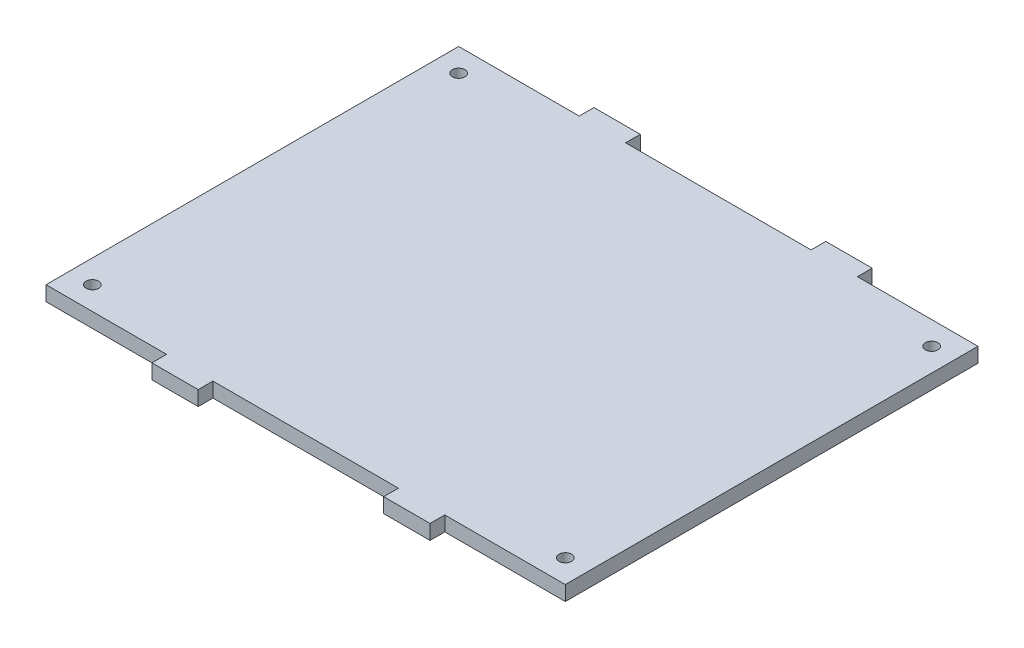
ISO-10303-21;
HEADER;
FILE_DESCRIPTION(('STEP AP214'),'2;1');
FILE_NAME('part.step','',(''),(''),'','','');
FILE_SCHEMA(('AUTOMOTIVE_DESIGN { 1 0 10303 214 1 1 1 1 }'));
ENDSEC;
DATA;
#1=APPLICATION_CONTEXT('core data for automotive mechanical design processes');
#2=APPLICATION_PROTOCOL_DEFINITION('international standard','automotive_design',2000,#1);
#3=PRODUCT_CONTEXT('',#1,'mechanical');
#4=PRODUCT('Part','Part','',(#3));
#5=PRODUCT_RELATED_PRODUCT_CATEGORY('part','',(#4));
#6=PRODUCT_DEFINITION_FORMATION('','',#4);
#7=PRODUCT_DEFINITION_CONTEXT('part definition',#1,'design');
#8=PRODUCT_DEFINITION('design','',#6,#7);
#9=PRODUCT_DEFINITION_SHAPE('','',#8);
#10=(LENGTH_UNIT() NAMED_UNIT(*) SI_UNIT(.MILLI.,.METRE.));
#11=(NAMED_UNIT(*) PLANE_ANGLE_UNIT() SI_UNIT($,.RADIAN.));
#12=(NAMED_UNIT(*) SI_UNIT($,.STERADIAN.) SOLID_ANGLE_UNIT());
#13=UNCERTAINTY_MEASURE_WITH_UNIT(LENGTH_MEASURE(1.E-05),#10,'distance_accuracy_value','');
#14=(GEOMETRIC_REPRESENTATION_CONTEXT(3) GLOBAL_UNCERTAINTY_ASSIGNED_CONTEXT((#13)) GLOBAL_UNIT_ASSIGNED_CONTEXT((#10,
#11,#12)) REPRESENTATION_CONTEXT('',''));
#15=CARTESIAN_POINT('',(0.,0.,0.));
#16=DIRECTION('',(0.,0.,1.));
#17=DIRECTION('',(1.,0.,0.));
#18=AXIS2_PLACEMENT_3D('',#15,#16,#17);
#19=CARTESIAN_POINT('',(-56.,3.175,47.675));
#20=DIRECTION('',(0.,0.,-1.));
#21=DIRECTION('',(-1.,0.,0.));
#22=AXIS2_PLACEMENT_3D('',#19,#20,#21);
#23=PLANE('',#22);
#24=DIRECTION('',(1.,0.,0.));
#25=VECTOR('',#24,1.);
#26=CARTESIAN_POINT('',(-56.,3.175,47.675));
#27=LINE('',#26,#25);
#28=CARTESIAN_POINT('',(-30.,3.175,47.675));
#29=VERTEX_POINT('',#28);
#30=CARTESIAN_POINT('',(-20.,3.175,47.675));
#31=VERTEX_POINT('',#30);
#32=EDGE_CURVE('E11',#29,#31,#27,.T.);
#33=ORIENTED_EDGE('',*,*,#32,.F.);
#34=DIRECTION('',(0.,1.,0.));
#35=VECTOR('',#34,1.);
#36=CARTESIAN_POINT('',(-30.,0.,47.675));
#37=LINE('',#36,#35);
#38=CARTESIAN_POINT('',(-30.,0.,47.675));
#39=VERTEX_POINT('',#38);
#40=EDGE_CURVE('E295',#39,#29,#37,.T.);
#41=ORIENTED_EDGE('',*,*,#40,.F.);
#42=DIRECTION('',(1.,0.,0.));
#43=VECTOR('',#42,1.);
#44=CARTESIAN_POINT('',(-56.,0.,47.675));
#45=LINE('',#44,#43);
#46=CARTESIAN_POINT('',(-20.,0.,47.675));
#47=VERTEX_POINT('',#46);
#48=EDGE_CURVE('E37',#39,#47,#45,.T.);
#49=ORIENTED_EDGE('',*,*,#48,.T.);
#50=DIRECTION('',(0.,1.,0.));
#51=VECTOR('',#50,1.);
#52=CARTESIAN_POINT('',(-20.,0.,47.675));
#53=LINE('',#52,#51);
#54=EDGE_CURVE('E277',#47,#31,#53,.T.);
#55=ORIENTED_EDGE('',*,*,#54,.T.);
#56=EDGE_LOOP('',(#33,#41,#49,#55));
#57=FACE_BOUND('',#56,.T.);
#58=ADVANCED_FACE('F33',(#57),#23,.F.);
#59=CARTESIAN_POINT('',(-56.,3.175,-47.675));
#60=DIRECTION('',(0.,0.,1.));
#61=DIRECTION('',(1.,0.,0.));
#62=AXIS2_PLACEMENT_3D('',#59,#60,#61);
#63=PLANE('',#62);
#64=DIRECTION('',(-1.,0.,0.));
#65=VECTOR('',#64,1.);
#66=CARTESIAN_POINT('',(-56.,0.,-47.675));
#67=LINE('',#66,#65);
#68=CARTESIAN_POINT('',(-20.,0.,-47.675));
#69=VERTEX_POINT('',#68);
#70=CARTESIAN_POINT('',(-30.,0.,-47.675));
#71=VERTEX_POINT('',#70);
#72=EDGE_CURVE('E200',#69,#71,#67,.T.);
#73=ORIENTED_EDGE('',*,*,#72,.T.);
#74=DIRECTION('',(0.,1.,0.));
#75=VECTOR('',#74,1.);
#76=CARTESIAN_POINT('',(-30.,0.,-47.675));
#77=LINE('',#76,#75);
#78=CARTESIAN_POINT('',(-30.,3.175,-47.675));
#79=VERTEX_POINT('',#78);
#80=EDGE_CURVE('E254',#71,#79,#77,.T.);
#81=ORIENTED_EDGE('',*,*,#80,.T.);
#82=DIRECTION('',(-1.,0.,0.));
#83=VECTOR('',#82,1.);
#84=CARTESIAN_POINT('',(-56.,3.175,-47.675));
#85=LINE('',#84,#83);
#86=CARTESIAN_POINT('',(-20.,3.175,-47.675));
#87=VERTEX_POINT('',#86);
#88=EDGE_CURVE('E211',#87,#79,#85,.T.);
#89=ORIENTED_EDGE('',*,*,#88,.F.);
#90=DIRECTION('',(0.,1.,0.));
#91=VECTOR('',#90,1.);
#92=CARTESIAN_POINT('',(-20.,0.,-47.675));
#93=LINE('',#92,#91);
#94=EDGE_CURVE('E204',#69,#87,#93,.T.);
#95=ORIENTED_EDGE('',*,*,#94,.F.);
#96=EDGE_LOOP('',(#73,#81,#89,#95));
#97=FACE_BOUND('',#96,.T.);
#98=ADVANCED_FACE('F399',(#97),#63,.F.);
#99=CARTESIAN_POINT('',(56.,3.175,47.675));
#100=DIRECTION('',(-1.,0.,0.));
#101=DIRECTION('',(0.,0.,1.));
#102=AXIS2_PLACEMENT_3D('',#99,#100,#101);
#103=PLANE('',#102);
#104=DIRECTION('',(0.,0.,-1.));
#105=VECTOR('',#104,1.);
#106=CARTESIAN_POINT('',(56.,3.175,47.675));
#107=LINE('',#106,#105);
#108=CARTESIAN_POINT('',(56.,3.175,44.5));
#109=VERTEX_POINT('',#108);
#110=CARTESIAN_POINT('',(56.,3.175,-44.5));
#111=VERTEX_POINT('',#110);
#112=EDGE_CURVE('E194',#109,#111,#107,.T.);
#113=ORIENTED_EDGE('',*,*,#112,.F.);
#114=DIRECTION('',(0.,1.,0.));
#115=VECTOR('',#114,1.);
#116=CARTESIAN_POINT('',(56.,0.,44.5));
#117=LINE('',#116,#115);
#118=CARTESIAN_POINT('',(56.,0.,44.5));
#119=VERTEX_POINT('',#118);
#120=EDGE_CURVE('E178',#119,#109,#117,.T.);
#121=ORIENTED_EDGE('',*,*,#120,.F.);
#122=DIRECTION('',(0.,0.,-1.));
#123=VECTOR('',#122,1.);
#124=CARTESIAN_POINT('',(56.,0.,47.675));
#125=LINE('',#124,#123);
#126=CARTESIAN_POINT('',(56.,0.,-44.5));
#127=VERTEX_POINT('',#126);
#128=EDGE_CURVE('E203',#119,#127,#125,.T.);
#129=ORIENTED_EDGE('',*,*,#128,.T.);
#130=DIRECTION('',(0.,1.,0.));
#131=VECTOR('',#130,1.);
#132=CARTESIAN_POINT('',(56.,0.,-44.5));
#133=LINE('',#132,#131);
#134=EDGE_CURVE('E242',#127,#111,#133,.T.);
#135=ORIENTED_EDGE('',*,*,#134,.T.);
#136=EDGE_LOOP('',(#113,#121,#129,#135));
#137=FACE_BOUND('',#136,.T.);
#138=ADVANCED_FACE('F35',(#137),#103,.F.);
#139=CARTESIAN_POINT('',(30.,3.175,-47.675));
#140=VERTEX_POINT('',#139);
#141=CARTESIAN_POINT('',(20.,3.175,-47.675));
#142=VERTEX_POINT('',#141);
#143=EDGE_CURVE('E209',#140,#142,#85,.T.);
#144=ORIENTED_EDGE('',*,*,#143,.F.);
#145=DIRECTION('',(0.,1.,0.));
#146=VECTOR('',#145,1.);
#147=CARTESIAN_POINT('',(30.,0.,-47.675));
#148=LINE('',#147,#146);
#149=CARTESIAN_POINT('',(30.,0.,-47.675));
#150=VERTEX_POINT('',#149);
#151=EDGE_CURVE('E232',#150,#140,#148,.T.);
#152=ORIENTED_EDGE('',*,*,#151,.F.);
#153=CARTESIAN_POINT('',(20.,0.,-47.675));
#154=VERTEX_POINT('',#153);
#155=EDGE_CURVE('E196',#150,#154,#67,.T.);
#156=ORIENTED_EDGE('',*,*,#155,.T.);
#157=DIRECTION('',(0.,1.,0.));
#158=VECTOR('',#157,1.);
#159=CARTESIAN_POINT('',(20.,0.,-47.675));
#160=LINE('',#159,#158);
#161=EDGE_CURVE('E218',#154,#142,#160,.T.);
#162=ORIENTED_EDGE('',*,*,#161,.T.);
#163=EDGE_LOOP('',(#144,#152,#156,#162));
#164=FACE_BOUND('',#163,.T.);
#165=ADVANCED_FACE('F405',(#164),#63,.F.);
#166=CARTESIAN_POINT('',(-56.,3.175,47.675));
#167=DIRECTION('',(1.,0.,0.));
#168=DIRECTION('',(0.,0.,-1.));
#169=AXIS2_PLACEMENT_3D('',#166,#167,#168);
#170=PLANE('',#169);
#171=DIRECTION('',(0.,0.,1.));
#172=VECTOR('',#171,1.);
#173=CARTESIAN_POINT('',(-56.,0.,47.675));
#174=LINE('',#173,#172);
#175=CARTESIAN_POINT('',(-56.,0.,-44.5));
#176=VERTEX_POINT('',#175);
#177=CARTESIAN_POINT('',(-56.,0.,44.5));
#178=VERTEX_POINT('',#177);
#179=EDGE_CURVE('E193',#176,#178,#174,.T.);
#180=ORIENTED_EDGE('',*,*,#179,.T.);
#181=DIRECTION('',(0.,1.,0.));
#182=VECTOR('',#181,1.);
#183=CARTESIAN_POINT('',(-56.,0.,44.5));
#184=LINE('',#183,#182);
#185=CARTESIAN_POINT('',(-56.,3.175,44.5));
#186=VERTEX_POINT('',#185);
#187=EDGE_CURVE('E58',#178,#186,#184,.T.);
#188=ORIENTED_EDGE('',*,*,#187,.T.);
#189=DIRECTION('',(0.,0.,1.));
#190=VECTOR('',#189,1.);
#191=CARTESIAN_POINT('',(-56.,3.175,47.675));
#192=LINE('',#191,#190);
#193=CARTESIAN_POINT('',(-56.,3.175,-44.5));
#194=VERTEX_POINT('',#193);
#195=EDGE_CURVE('E206',#194,#186,#192,.T.);
#196=ORIENTED_EDGE('',*,*,#195,.F.);
#197=DIRECTION('',(0.,1.,0.));
#198=VECTOR('',#197,1.);
#199=CARTESIAN_POINT('',(-56.,0.,-44.5));
#200=LINE('',#199,#198);
#201=EDGE_CURVE('E259',#176,#194,#200,.T.);
#202=ORIENTED_EDGE('',*,*,#201,.F.);
#203=EDGE_LOOP('',(#180,#188,#196,#202));
#204=FACE_BOUND('',#203,.T.);
#205=ADVANCED_FACE('F409',(#204),#170,.F.);
#206=CARTESIAN_POINT('',(20.,0.,47.675));
#207=VERTEX_POINT('',#206);
#208=CARTESIAN_POINT('',(30.,0.,47.675));
#209=VERTEX_POINT('',#208);
#210=EDGE_CURVE('E186',#207,#209,#45,.T.);
#211=ORIENTED_EDGE('',*,*,#210,.T.);
#212=DIRECTION('',(0.,1.,0.));
#213=VECTOR('',#212,1.);
#214=CARTESIAN_POINT('',(30.,0.,47.675));
#215=LINE('',#214,#213);
#216=CARTESIAN_POINT('',(30.,3.175,47.675));
#217=VERTEX_POINT('',#216);
#218=EDGE_CURVE('E170',#209,#217,#215,.T.);
#219=ORIENTED_EDGE('',*,*,#218,.T.);
#220=CARTESIAN_POINT('',(20.,3.175,47.675));
#221=VERTEX_POINT('',#220);
#222=EDGE_CURVE('E42',#221,#217,#27,.T.);
#223=ORIENTED_EDGE('',*,*,#222,.F.);
#224=DIRECTION('',(0.,1.,0.));
#225=VECTOR('',#224,1.);
#226=CARTESIAN_POINT('',(20.,0.,47.675));
#227=LINE('',#226,#225);
#228=EDGE_CURVE('E192',#207,#221,#227,.T.);
#229=ORIENTED_EDGE('',*,*,#228,.F.);
#230=EDGE_LOOP('',(#211,#219,#223,#229));
#231=FACE_BOUND('',#230,.T.);
#232=ADVANCED_FACE('F191',(#231),#23,.F.);
#233=CARTESIAN_POINT('',(0.,3.175,0.));
#234=DIRECTION('',(0.,-1.,0.));
#235=DIRECTION('',(0.,0.,-1.));
#236=AXIS2_PLACEMENT_3D('',#233,#234,#235);
#237=PLANE('',#236);
#238=CARTESIAN_POINT('',(51.,3.175,39.5));
#239=DIRECTION('',(0.,1.,0.));
#240=DIRECTION('',(0.,0.,1.));
#241=AXIS2_PLACEMENT_3D('',#238,#239,#240);
#242=CIRCLE('',#241,1.35);
#243=CARTESIAN_POINT('',(51.,3.175,40.85));
#244=VERTEX_POINT('',#243);
#245=EDGE_CURVE('E342',#244,#244,#242,.T.);
#246=ORIENTED_EDGE('',*,*,#245,.F.);
#247=EDGE_LOOP('',(#246));
#248=FACE_BOUND('',#247,.T.);
#249=CARTESIAN_POINT('',(-51.,3.175,39.5));
#250=DIRECTION('',(0.,1.,0.));
#251=DIRECTION('',(0.,0.,1.));
#252=AXIS2_PLACEMENT_3D('',#249,#250,#251);
#253=CIRCLE('',#252,1.35);
#254=CARTESIAN_POINT('',(-51.,3.175,40.85));
#255=VERTEX_POINT('',#254);
#256=EDGE_CURVE('E336',#255,#255,#253,.T.);
#257=ORIENTED_EDGE('',*,*,#256,.F.);
#258=EDGE_LOOP('',(#257));
#259=FACE_BOUND('',#258,.T.);
#260=CARTESIAN_POINT('',(51.,3.175,-39.5));
#261=DIRECTION('',(0.,1.,0.));
#262=DIRECTION('',(0.,0.,1.));
#263=AXIS2_PLACEMENT_3D('',#260,#261,#262);
#264=CIRCLE('',#263,1.35);
#265=CARTESIAN_POINT('',(51.,3.175,-38.15));
#266=VERTEX_POINT('',#265);
#267=EDGE_CURVE('E330',#266,#266,#264,.T.);
#268=ORIENTED_EDGE('',*,*,#267,.F.);
#269=EDGE_LOOP('',(#268));
#270=FACE_BOUND('',#269,.T.);
#271=CARTESIAN_POINT('',(-51.,3.175,-39.5));
#272=DIRECTION('',(0.,1.,0.));
#273=DIRECTION('',(0.,0.,1.));
#274=AXIS2_PLACEMENT_3D('',#271,#272,#273);
#275=CIRCLE('',#274,1.35);
#276=CARTESIAN_POINT('',(-51.,3.175,-38.15));
#277=VERTEX_POINT('',#276);
#278=EDGE_CURVE('E324',#277,#277,#275,.T.);
#279=ORIENTED_EDGE('',*,*,#278,.F.);
#280=EDGE_LOOP('',(#279));
#281=FACE_BOUND('',#280,.T.);
#282=ORIENTED_EDGE('',*,*,#222,.T.);
#283=DIRECTION('',(0.,0.,1.));
#284=VECTOR('',#283,1.);
#285=CARTESIAN_POINT('',(30.,3.175,44.5));
#286=LINE('',#285,#284);
#287=CARTESIAN_POINT('',(30.,3.175,44.5));
#288=VERTEX_POINT('',#287);
#289=EDGE_CURVE('E173',#288,#217,#286,.T.);
#290=ORIENTED_EDGE('',*,*,#289,.F.);
#291=DIRECTION('',(-1.,0.,0.));
#292=VECTOR('',#291,1.);
#293=CARTESIAN_POINT('',(30.,3.175,44.5));
#294=LINE('',#293,#292);
#295=EDGE_CURVE('E188',#109,#288,#294,.T.);
#296=ORIENTED_EDGE('',*,*,#295,.F.);
#297=ORIENTED_EDGE('',*,*,#112,.T.);
#298=DIRECTION('',(1.,0.,0.));
#299=VECTOR('',#298,1.);
#300=CARTESIAN_POINT('',(30.,3.175,-44.5));
#301=LINE('',#300,#299);
#302=CARTESIAN_POINT('',(30.,3.175,-44.5));
#303=VERTEX_POINT('',#302);
#304=EDGE_CURVE('E247',#303,#111,#301,.T.);
#305=ORIENTED_EDGE('',*,*,#304,.F.);
#306=DIRECTION('',(0.,0.,1.));
#307=VECTOR('',#306,1.);
#308=CARTESIAN_POINT('',(30.,3.175,-47.675));
#309=LINE('',#308,#307);
#310=EDGE_CURVE('E251',#140,#303,#309,.T.);
#311=ORIENTED_EDGE('',*,*,#310,.F.);
#312=ORIENTED_EDGE('',*,*,#143,.T.);
#313=DIRECTION('',(0.,0.,-1.));
#314=VECTOR('',#313,1.);
#315=CARTESIAN_POINT('',(20.,3.175,-47.675));
#316=LINE('',#315,#314);
#317=CARTESIAN_POINT('',(20.,3.175,-44.5));
#318=VERTEX_POINT('',#317);
#319=EDGE_CURVE('E222',#318,#142,#316,.T.);
#320=ORIENTED_EDGE('',*,*,#319,.F.);
#321=DIRECTION('',(1.,0.,0.));
#322=VECTOR('',#321,1.);
#323=CARTESIAN_POINT('',(-20.,3.175,-44.5));
#324=LINE('',#323,#322);
#325=CARTESIAN_POINT('',(-20.,3.175,-44.5));
#326=VERTEX_POINT('',#325);
#327=EDGE_CURVE('E226',#326,#318,#324,.T.);
#328=ORIENTED_EDGE('',*,*,#327,.F.);
#329=DIRECTION('',(0.,0.,1.));
#330=VECTOR('',#329,1.);
#331=CARTESIAN_POINT('',(-20.,3.175,-47.675));
#332=LINE('',#331,#330);
#333=EDGE_CURVE('E229',#87,#326,#332,.T.);
#334=ORIENTED_EDGE('',*,*,#333,.F.);
#335=ORIENTED_EDGE('',*,*,#88,.T.);
#336=DIRECTION('',(0.,0.,-1.));
#337=VECTOR('',#336,1.);
#338=CARTESIAN_POINT('',(-30.,3.175,-47.675));
#339=LINE('',#338,#337);
#340=CARTESIAN_POINT('',(-30.,3.175,-44.5));
#341=VERTEX_POINT('',#340);
#342=EDGE_CURVE('E266',#341,#79,#339,.T.);
#343=ORIENTED_EDGE('',*,*,#342,.F.);
#344=DIRECTION('',(1.,0.,0.));
#345=VECTOR('',#344,1.);
#346=CARTESIAN_POINT('',(-56.,3.175,-44.5));
#347=LINE('',#346,#345);
#348=EDGE_CURVE('E269',#194,#341,#347,.T.);
#349=ORIENTED_EDGE('',*,*,#348,.F.);
#350=ORIENTED_EDGE('',*,*,#195,.T.);
#351=DIRECTION('',(-1.,0.,0.));
#352=VECTOR('',#351,1.);
#353=CARTESIAN_POINT('',(-30.,3.175,44.5));
#354=LINE('',#353,#352);
#355=CARTESIAN_POINT('',(-30.,3.175,44.5));
#356=VERTEX_POINT('',#355);
#357=EDGE_CURVE('E307',#356,#186,#354,.T.);
#358=ORIENTED_EDGE('',*,*,#357,.F.);
#359=DIRECTION('',(0.,0.,-1.));
#360=VECTOR('',#359,1.);
#361=CARTESIAN_POINT('',(-30.,3.175,44.5));
#362=LINE('',#361,#360);
#363=EDGE_CURVE('E310',#29,#356,#362,.T.);
#364=ORIENTED_EDGE('',*,*,#363,.F.);
#365=ORIENTED_EDGE('',*,*,#32,.T.);
#366=DIRECTION('',(0.,0.,1.));
#367=VECTOR('',#366,1.);
#368=CARTESIAN_POINT('',(-20.,3.175,47.675));
#369=LINE('',#368,#367);
#370=CARTESIAN_POINT('',(-20.,3.175,44.5));
#371=VERTEX_POINT('',#370);
#372=EDGE_CURVE('E292',#371,#31,#369,.T.);
#373=ORIENTED_EDGE('',*,*,#372,.F.);
#374=DIRECTION('',(-1.,0.,0.));
#375=VECTOR('',#374,1.);
#376=CARTESIAN_POINT('',(-20.,3.175,44.5));
#377=LINE('',#376,#375);
#378=CARTESIAN_POINT('',(20.,3.175,44.5));
#379=VERTEX_POINT('',#378);
#380=EDGE_CURVE('E285',#379,#371,#377,.T.);
#381=ORIENTED_EDGE('',*,*,#380,.F.);
#382=DIRECTION('',(0.,0.,-1.));
#383=VECTOR('',#382,1.);
#384=CARTESIAN_POINT('',(20.,3.175,47.675));
#385=LINE('',#384,#383);
#386=EDGE_CURVE('E289',#221,#379,#385,.T.);
#387=ORIENTED_EDGE('',*,*,#386,.F.);
#388=EDGE_LOOP('',(#282,#290,#296,#297,#305,#311,#312,#320,#328,#334,#335,#343,#349,#350,#358,
#364,#365,#373,#381,#387));
#389=FACE_BOUND('',#388,.T.);
#390=ADVANCED_FACE('F357',(#248,#259,#270,#281,#389),#237,.F.);
#391=CARTESIAN_POINT('',(0.,0.,0.));
#392=DIRECTION('',(0.,-1.,0.));
#393=DIRECTION('',(0.,0.,-1.));
#394=AXIS2_PLACEMENT_3D('',#391,#392,#393);
#395=PLANE('',#394);
#396=CARTESIAN_POINT('',(51.,0.,39.5));
#397=DIRECTION('',(0.,1.,0.));
#398=DIRECTION('',(0.,0.,1.));
#399=AXIS2_PLACEMENT_3D('',#396,#397,#398);
#400=CIRCLE('',#399,1.35);
#401=CARTESIAN_POINT('',(51.,0.,40.85));
#402=VERTEX_POINT('',#401);
#403=EDGE_CURVE('E339',#402,#402,#400,.T.);
#404=ORIENTED_EDGE('',*,*,#403,.T.);
#405=EDGE_LOOP('',(#404));
#406=FACE_BOUND('',#405,.T.);
#407=CARTESIAN_POINT('',(-51.,0.,39.5));
#408=DIRECTION('',(0.,1.,0.));
#409=DIRECTION('',(0.,0.,1.));
#410=AXIS2_PLACEMENT_3D('',#407,#408,#409);
#411=CIRCLE('',#410,1.35);
#412=CARTESIAN_POINT('',(-51.,0.,40.85));
#413=VERTEX_POINT('',#412);
#414=EDGE_CURVE('E333',#413,#413,#411,.T.);
#415=ORIENTED_EDGE('',*,*,#414,.T.);
#416=EDGE_LOOP('',(#415));
#417=FACE_BOUND('',#416,.T.);
#418=CARTESIAN_POINT('',(51.,0.,-39.5));
#419=DIRECTION('',(0.,1.,0.));
#420=DIRECTION('',(0.,0.,1.));
#421=AXIS2_PLACEMENT_3D('',#418,#419,#420);
#422=CIRCLE('',#421,1.35);
#423=CARTESIAN_POINT('',(51.,0.,-38.15));
#424=VERTEX_POINT('',#423);
#425=EDGE_CURVE('E327',#424,#424,#422,.T.);
#426=ORIENTED_EDGE('',*,*,#425,.T.);
#427=EDGE_LOOP('',(#426));
#428=FACE_BOUND('',#427,.T.);
#429=CARTESIAN_POINT('',(-51.,0.,-39.5));
#430=DIRECTION('',(0.,1.,0.));
#431=DIRECTION('',(0.,0.,1.));
#432=AXIS2_PLACEMENT_3D('',#429,#430,#431);
#433=CIRCLE('',#432,1.35);
#434=CARTESIAN_POINT('',(-51.,0.,-38.15));
#435=VERTEX_POINT('',#434);
#436=EDGE_CURVE('E322',#435,#435,#433,.T.);
#437=ORIENTED_EDGE('',*,*,#436,.T.);
#438=EDGE_LOOP('',(#437));
#439=FACE_BOUND('',#438,.T.);
#440=DIRECTION('',(0.,0.,1.));
#441=VECTOR('',#440,1.);
#442=CARTESIAN_POINT('',(30.,0.,44.5));
#443=LINE('',#442,#441);
#444=CARTESIAN_POINT('',(30.,0.,44.5));
#445=VERTEX_POINT('',#444);
#446=EDGE_CURVE('E50',#445,#209,#443,.T.);
#447=ORIENTED_EDGE('',*,*,#446,.T.);
#448=ORIENTED_EDGE('',*,*,#210,.F.);
#449=DIRECTION('',(0.,0.,-1.));
#450=VECTOR('',#449,1.);
#451=CARTESIAN_POINT('',(20.,0.,47.675));
#452=LINE('',#451,#450);
#453=CARTESIAN_POINT('',(20.,0.,44.5));
#454=VERTEX_POINT('',#453);
#455=EDGE_CURVE('E298',#207,#454,#452,.T.);
#456=ORIENTED_EDGE('',*,*,#455,.T.);
#457=DIRECTION('',(-1.,0.,0.));
#458=VECTOR('',#457,1.);
#459=CARTESIAN_POINT('',(-20.,0.,44.5));
#460=LINE('',#459,#458);
#461=CARTESIAN_POINT('',(-20.,0.,44.5));
#462=VERTEX_POINT('',#461);
#463=EDGE_CURVE('E280',#454,#462,#460,.T.);
#464=ORIENTED_EDGE('',*,*,#463,.T.);
#465=DIRECTION('',(0.,0.,1.));
#466=VECTOR('',#465,1.);
#467=CARTESIAN_POINT('',(-20.,0.,47.675));
#468=LINE('',#467,#466);
#469=EDGE_CURVE('E288',#462,#47,#468,.T.);
#470=ORIENTED_EDGE('',*,*,#469,.T.);
#471=ORIENTED_EDGE('',*,*,#48,.F.);
#472=DIRECTION('',(0.,0.,-1.));
#473=VECTOR('',#472,1.);
#474=CARTESIAN_POINT('',(-30.,0.,44.5));
#475=LINE('',#474,#473);
#476=CARTESIAN_POINT('',(-30.,0.,44.5));
#477=VERTEX_POINT('',#476);
#478=EDGE_CURVE('E309',#39,#477,#475,.T.);
#479=ORIENTED_EDGE('',*,*,#478,.T.);
#480=DIRECTION('',(-1.,0.,0.));
#481=VECTOR('',#480,1.);
#482=CARTESIAN_POINT('',(-30.,0.,44.5));
#483=LINE('',#482,#481);
#484=EDGE_CURVE('E304',#477,#178,#483,.T.);
#485=ORIENTED_EDGE('',*,*,#484,.T.);
#486=ORIENTED_EDGE('',*,*,#179,.F.);
#487=DIRECTION('',(1.,0.,0.));
#488=VECTOR('',#487,1.);
#489=CARTESIAN_POINT('',(-56.,0.,-44.5));
#490=LINE('',#489,#488);
#491=CARTESIAN_POINT('',(-30.,0.,-44.5));
#492=VERTEX_POINT('',#491);
#493=EDGE_CURVE('E268',#176,#492,#490,.T.);
#494=ORIENTED_EDGE('',*,*,#493,.T.);
#495=DIRECTION('',(0.,0.,-1.));
#496=VECTOR('',#495,1.);
#497=CARTESIAN_POINT('',(-30.,0.,-47.675));
#498=LINE('',#497,#496);
#499=EDGE_CURVE('E262',#492,#71,#498,.T.);
#500=ORIENTED_EDGE('',*,*,#499,.T.);
#501=ORIENTED_EDGE('',*,*,#72,.F.);
#502=DIRECTION('',(0.,0.,1.));
#503=VECTOR('',#502,1.);
#504=CARTESIAN_POINT('',(-20.,0.,-47.675));
#505=LINE('',#504,#503);
#506=CARTESIAN_POINT('',(-20.,0.,-44.5));
#507=VERTEX_POINT('',#506);
#508=EDGE_CURVE('E225',#69,#507,#505,.T.);
#509=ORIENTED_EDGE('',*,*,#508,.T.);
#510=DIRECTION('',(1.,0.,0.));
#511=VECTOR('',#510,1.);
#512=CARTESIAN_POINT('',(-20.,0.,-44.5));
#513=LINE('',#512,#511);
#514=CARTESIAN_POINT('',(20.,0.,-44.5));
#515=VERTEX_POINT('',#514);
#516=EDGE_CURVE('E235',#507,#515,#513,.T.);
#517=ORIENTED_EDGE('',*,*,#516,.T.);
#518=DIRECTION('',(0.,0.,-1.));
#519=VECTOR('',#518,1.);
#520=CARTESIAN_POINT('',(20.,0.,-47.675));
#521=LINE('',#520,#519);
#522=EDGE_CURVE('E216',#515,#154,#521,.T.);
#523=ORIENTED_EDGE('',*,*,#522,.T.);
#524=ORIENTED_EDGE('',*,*,#155,.F.);
#525=DIRECTION('',(0.,0.,1.));
#526=VECTOR('',#525,1.);
#527=CARTESIAN_POINT('',(30.,0.,-47.675));
#528=LINE('',#527,#526);
#529=CARTESIAN_POINT('',(30.,0.,-44.5));
#530=VERTEX_POINT('',#529);
#531=EDGE_CURVE('E250',#150,#530,#528,.T.);
#532=ORIENTED_EDGE('',*,*,#531,.T.);
#533=DIRECTION('',(1.,0.,0.));
#534=VECTOR('',#533,1.);
#535=CARTESIAN_POINT('',(30.,0.,-44.5));
#536=LINE('',#535,#534);
#537=EDGE_CURVE('E243',#530,#127,#536,.T.);
#538=ORIENTED_EDGE('',*,*,#537,.T.);
#539=ORIENTED_EDGE('',*,*,#128,.F.);
#540=DIRECTION('',(-1.,0.,0.));
#541=VECTOR('',#540,1.);
#542=CARTESIAN_POINT('',(30.,0.,44.5));
#543=LINE('',#542,#541);
#544=EDGE_CURVE('E179',#119,#445,#543,.T.);
#545=ORIENTED_EDGE('',*,*,#544,.T.);
#546=EDGE_LOOP('',(#447,#448,#456,#464,#470,#471,#479,#485,#486,#494,#500,#501,#509,#517,#523,
#524,#532,#538,#539,#545));
#547=FACE_BOUND('',#546,.T.);
#548=ADVANCED_FACE('F184',(#406,#417,#428,#439,#547),#395,.T.);
#549=CARTESIAN_POINT('',(-20.,0.,-47.675));
#550=DIRECTION('',(-1.,0.,0.));
#551=DIRECTION('',(0.,0.,1.));
#552=AXIS2_PLACEMENT_3D('',#549,#550,#551);
#553=PLANE('',#552);
#554=ORIENTED_EDGE('',*,*,#333,.T.);
#555=DIRECTION('',(0.,1.,0.));
#556=VECTOR('',#555,1.);
#557=CARTESIAN_POINT('',(-20.,0.,-44.5));
#558=LINE('',#557,#556);
#559=EDGE_CURVE('E213',#507,#326,#558,.T.);
#560=ORIENTED_EDGE('',*,*,#559,.F.);
#561=ORIENTED_EDGE('',*,*,#508,.F.);
#562=ORIENTED_EDGE('',*,*,#94,.T.);
#563=EDGE_LOOP('',(#554,#560,#561,#562));
#564=FACE_BOUND('',#563,.T.);
#565=ADVANCED_FACE('F469',(#564),#553,.F.);
#566=CARTESIAN_POINT('',(20.,0.,-47.675));
#567=DIRECTION('',(1.,0.,0.));
#568=DIRECTION('',(0.,0.,-1.));
#569=AXIS2_PLACEMENT_3D('',#566,#567,#568);
#570=PLANE('',#569);
#571=ORIENTED_EDGE('',*,*,#319,.T.);
#572=ORIENTED_EDGE('',*,*,#161,.F.);
#573=ORIENTED_EDGE('',*,*,#522,.F.);
#574=DIRECTION('',(0.,1.,0.));
#575=VECTOR('',#574,1.);
#576=CARTESIAN_POINT('',(20.,0.,-44.5));
#577=LINE('',#576,#575);
#578=EDGE_CURVE('E215',#515,#318,#577,.T.);
#579=ORIENTED_EDGE('',*,*,#578,.T.);
#580=EDGE_LOOP('',(#571,#572,#573,#579));
#581=FACE_BOUND('',#580,.T.);
#582=ADVANCED_FACE('F430',(#581),#570,.F.);
#583=CARTESIAN_POINT('',(-20.,0.,-44.5));
#584=DIRECTION('',(0.,0.,1.));
#585=DIRECTION('',(1.,0.,0.));
#586=AXIS2_PLACEMENT_3D('',#583,#584,#585);
#587=PLANE('',#586);
#588=ORIENTED_EDGE('',*,*,#327,.T.);
#589=ORIENTED_EDGE('',*,*,#578,.F.);
#590=ORIENTED_EDGE('',*,*,#516,.F.);
#591=ORIENTED_EDGE('',*,*,#559,.T.);
#592=EDGE_LOOP('',(#588,#589,#590,#591));
#593=FACE_BOUND('',#592,.T.);
#594=ADVANCED_FACE('F434',(#593),#587,.F.);
#595=CARTESIAN_POINT('',(30.,0.,-47.675));
#596=DIRECTION('',(-1.,0.,0.));
#597=DIRECTION('',(0.,0.,1.));
#598=AXIS2_PLACEMENT_3D('',#595,#596,#597);
#599=PLANE('',#598);
#600=ORIENTED_EDGE('',*,*,#310,.T.);
#601=DIRECTION('',(0.,1.,0.));
#602=VECTOR('',#601,1.);
#603=CARTESIAN_POINT('',(30.,0.,-44.5));
#604=LINE('',#603,#602);
#605=EDGE_CURVE('E240',#530,#303,#604,.T.);
#606=ORIENTED_EDGE('',*,*,#605,.F.);
#607=ORIENTED_EDGE('',*,*,#531,.F.);
#608=ORIENTED_EDGE('',*,*,#151,.T.);
#609=EDGE_LOOP('',(#600,#606,#607,#608));
#610=FACE_BOUND('',#609,.T.);
#611=ADVANCED_FACE('F462',(#610),#599,.F.);
#612=CARTESIAN_POINT('',(30.,0.,-44.5));
#613=DIRECTION('',(0.,0.,1.));
#614=DIRECTION('',(1.,0.,0.));
#615=AXIS2_PLACEMENT_3D('',#612,#613,#614);
#616=PLANE('',#615);
#617=ORIENTED_EDGE('',*,*,#304,.T.);
#618=ORIENTED_EDGE('',*,*,#134,.F.);
#619=ORIENTED_EDGE('',*,*,#537,.F.);
#620=ORIENTED_EDGE('',*,*,#605,.T.);
#621=EDGE_LOOP('',(#617,#618,#619,#620));
#622=FACE_BOUND('',#621,.T.);
#623=ADVANCED_FACE('F457',(#622),#616,.F.);
#624=CARTESIAN_POINT('',(-30.,0.,-47.675));
#625=DIRECTION('',(1.,0.,0.));
#626=DIRECTION('',(0.,0.,-1.));
#627=AXIS2_PLACEMENT_3D('',#624,#625,#626);
#628=PLANE('',#627);
#629=ORIENTED_EDGE('',*,*,#342,.T.);
#630=ORIENTED_EDGE('',*,*,#80,.F.);
#631=ORIENTED_EDGE('',*,*,#499,.F.);
#632=DIRECTION('',(0.,1.,0.));
#633=VECTOR('',#632,1.);
#634=CARTESIAN_POINT('',(-30.,0.,-44.5));
#635=LINE('',#634,#633);
#636=EDGE_CURVE('E261',#492,#341,#635,.T.);
#637=ORIENTED_EDGE('',*,*,#636,.T.);
#638=EDGE_LOOP('',(#629,#630,#631,#637));
#639=FACE_BOUND('',#638,.T.);
#640=ADVANCED_FACE('F444',(#639),#628,.F.);
#641=CARTESIAN_POINT('',(-56.,0.,-44.5));
#642=DIRECTION('',(0.,0.,1.));
#643=DIRECTION('',(1.,0.,0.));
#644=AXIS2_PLACEMENT_3D('',#641,#642,#643);
#645=PLANE('',#644);
#646=ORIENTED_EDGE('',*,*,#348,.T.);
#647=ORIENTED_EDGE('',*,*,#636,.F.);
#648=ORIENTED_EDGE('',*,*,#493,.F.);
#649=ORIENTED_EDGE('',*,*,#201,.T.);
#650=EDGE_LOOP('',(#646,#647,#648,#649));
#651=FACE_BOUND('',#650,.T.);
#652=ADVANCED_FACE('F447',(#651),#645,.F.);
#653=CARTESIAN_POINT('',(-20.,0.,47.675));
#654=DIRECTION('',(-1.,0.,0.));
#655=DIRECTION('',(0.,0.,1.));
#656=AXIS2_PLACEMENT_3D('',#653,#654,#655);
#657=PLANE('',#656);
#658=ORIENTED_EDGE('',*,*,#372,.T.);
#659=ORIENTED_EDGE('',*,*,#54,.F.);
#660=ORIENTED_EDGE('',*,*,#469,.F.);
#661=DIRECTION('',(0.,1.,0.));
#662=VECTOR('',#661,1.);
#663=CARTESIAN_POINT('',(-20.,0.,44.5));
#664=LINE('',#663,#662);
#665=EDGE_CURVE('E272',#462,#371,#664,.T.);
#666=ORIENTED_EDGE('',*,*,#665,.T.);
#667=EDGE_LOOP('',(#658,#659,#660,#666));
#668=FACE_BOUND('',#667,.T.);
#669=ADVANCED_FACE('F380',(#668),#657,.F.);
#670=CARTESIAN_POINT('',(-20.,0.,44.5));
#671=DIRECTION('',(0.,0.,-1.));
#672=DIRECTION('',(-1.,0.,0.));
#673=AXIS2_PLACEMENT_3D('',#670,#671,#672);
#674=PLANE('',#673);
#675=ORIENTED_EDGE('',*,*,#380,.T.);
#676=ORIENTED_EDGE('',*,*,#665,.F.);
#677=ORIENTED_EDGE('',*,*,#463,.F.);
#678=DIRECTION('',(0.,1.,0.));
#679=VECTOR('',#678,1.);
#680=CARTESIAN_POINT('',(20.,0.,44.5));
#681=LINE('',#680,#679);
#682=EDGE_CURVE('E282',#454,#379,#681,.T.);
#683=ORIENTED_EDGE('',*,*,#682,.T.);
#684=EDGE_LOOP('',(#675,#676,#677,#683));
#685=FACE_BOUND('',#684,.T.);
#686=ADVANCED_FACE('F377',(#685),#674,.F.);
#687=CARTESIAN_POINT('',(20.,0.,47.675));
#688=DIRECTION('',(1.,0.,0.));
#689=DIRECTION('',(0.,0.,-1.));
#690=AXIS2_PLACEMENT_3D('',#687,#688,#689);
#691=PLANE('',#690);
#692=ORIENTED_EDGE('',*,*,#386,.T.);
#693=ORIENTED_EDGE('',*,*,#682,.F.);
#694=ORIENTED_EDGE('',*,*,#455,.F.);
#695=ORIENTED_EDGE('',*,*,#228,.T.);
#696=EDGE_LOOP('',(#692,#693,#694,#695));
#697=FACE_BOUND('',#696,.T.);
#698=ADVANCED_FACE('F373',(#697),#691,.F.);
#699=CARTESIAN_POINT('',(-30.,0.,44.5));
#700=DIRECTION('',(1.,0.,0.));
#701=DIRECTION('',(0.,0.,-1.));
#702=AXIS2_PLACEMENT_3D('',#699,#700,#701);
#703=PLANE('',#702);
#704=ORIENTED_EDGE('',*,*,#363,.T.);
#705=DIRECTION('',(0.,1.,0.));
#706=VECTOR('',#705,1.);
#707=CARTESIAN_POINT('',(-30.,0.,44.5));
#708=LINE('',#707,#706);
#709=EDGE_CURVE('E302',#477,#356,#708,.T.);
#710=ORIENTED_EDGE('',*,*,#709,.F.);
#711=ORIENTED_EDGE('',*,*,#478,.F.);
#712=ORIENTED_EDGE('',*,*,#40,.T.);
#713=EDGE_LOOP('',(#704,#710,#711,#712));
#714=FACE_BOUND('',#713,.T.);
#715=ADVANCED_FACE('F385',(#714),#703,.F.);
#716=CARTESIAN_POINT('',(-30.,0.,44.5));
#717=DIRECTION('',(0.,0.,-1.));
#718=DIRECTION('',(-1.,0.,0.));
#719=AXIS2_PLACEMENT_3D('',#716,#717,#718);
#720=PLANE('',#719);
#721=ORIENTED_EDGE('',*,*,#357,.T.);
#722=ORIENTED_EDGE('',*,*,#187,.F.);
#723=ORIENTED_EDGE('',*,*,#484,.F.);
#724=ORIENTED_EDGE('',*,*,#709,.T.);
#725=EDGE_LOOP('',(#721,#722,#723,#724));
#726=FACE_BOUND('',#725,.T.);
#727=ADVANCED_FACE('F388',(#726),#720,.F.);
#728=CARTESIAN_POINT('',(30.,0.,44.5));
#729=DIRECTION('',(-1.,0.,0.));
#730=DIRECTION('',(0.,0.,1.));
#731=AXIS2_PLACEMENT_3D('',#728,#729,#730);
#732=PLANE('',#731);
#733=ORIENTED_EDGE('',*,*,#289,.T.);
#734=ORIENTED_EDGE('',*,*,#218,.F.);
#735=ORIENTED_EDGE('',*,*,#446,.F.);
#736=DIRECTION('',(0.,1.,0.));
#737=VECTOR('',#736,1.);
#738=CARTESIAN_POINT('',(30.,0.,44.5));
#739=LINE('',#738,#737);
#740=EDGE_CURVE('E313',#445,#288,#739,.T.);
#741=ORIENTED_EDGE('',*,*,#740,.T.);
#742=EDGE_LOOP('',(#733,#734,#735,#741));
#743=FACE_BOUND('',#742,.T.);
#744=ADVANCED_FACE('F171',(#743),#732,.F.);
#745=CARTESIAN_POINT('',(30.,0.,44.5));
#746=DIRECTION('',(0.,0.,-1.));
#747=DIRECTION('',(-1.,0.,0.));
#748=AXIS2_PLACEMENT_3D('',#745,#746,#747);
#749=PLANE('',#748);
#750=ORIENTED_EDGE('',*,*,#295,.T.);
#751=ORIENTED_EDGE('',*,*,#740,.F.);
#752=ORIENTED_EDGE('',*,*,#544,.F.);
#753=ORIENTED_EDGE('',*,*,#120,.T.);
#754=EDGE_LOOP('',(#750,#751,#752,#753));
#755=FACE_BOUND('',#754,.T.);
#756=ADVANCED_FACE('F395',(#755),#749,.F.);
#757=CARTESIAN_POINT('',(-51.,0.,-39.5));
#758=DIRECTION('',(0.,1.,0.));
#759=DIRECTION('',(0.,0.,1.));
#760=AXIS2_PLACEMENT_3D('',#757,#758,#759);
#761=CYLINDRICAL_SURFACE('',#760,1.35);
#762=ORIENTED_EDGE('',*,*,#436,.F.);
#763=EDGE_LOOP('',(#762));
#764=FACE_BOUND('',#763,.T.);
#765=ORIENTED_EDGE('',*,*,#278,.T.);
#766=EDGE_LOOP('',(#765));
#767=FACE_BOUND('',#766,.T.);
#768=ADVANCED_FACE('F553',(#764,#767),#761,.F.);
#769=CARTESIAN_POINT('',(51.,0.,-39.5));
#770=DIRECTION('',(0.,1.,0.));
#771=DIRECTION('',(0.,0.,1.));
#772=AXIS2_PLACEMENT_3D('',#769,#770,#771);
#773=CYLINDRICAL_SURFACE('',#772,1.35);
#774=ORIENTED_EDGE('',*,*,#425,.F.);
#775=EDGE_LOOP('',(#774));
#776=FACE_BOUND('',#775,.T.);
#777=ORIENTED_EDGE('',*,*,#267,.T.);
#778=EDGE_LOOP('',(#777));
#779=FACE_BOUND('',#778,.T.);
#780=ADVANCED_FACE('F607',(#776,#779),#773,.F.);
#781=CARTESIAN_POINT('',(-51.,0.,39.5));
#782=DIRECTION('',(0.,1.,0.));
#783=DIRECTION('',(0.,0.,1.));
#784=AXIS2_PLACEMENT_3D('',#781,#782,#783);
#785=CYLINDRICAL_SURFACE('',#784,1.35);
#786=ORIENTED_EDGE('',*,*,#414,.F.);
#787=EDGE_LOOP('',(#786));
#788=FACE_BOUND('',#787,.T.);
#789=ORIENTED_EDGE('',*,*,#256,.T.);
#790=EDGE_LOOP('',(#789));
#791=FACE_BOUND('',#790,.T.);
#792=ADVANCED_FACE('F353',(#788,#791),#785,.F.);
#793=CARTESIAN_POINT('',(51.,0.,39.5));
#794=DIRECTION('',(0.,1.,0.));
#795=DIRECTION('',(0.,0.,1.));
#796=AXIS2_PLACEMENT_3D('',#793,#794,#795);
#797=CYLINDRICAL_SURFACE('',#796,1.35);
#798=ORIENTED_EDGE('',*,*,#403,.F.);
#799=EDGE_LOOP('',(#798));
#800=FACE_BOUND('',#799,.T.);
#801=ORIENTED_EDGE('',*,*,#245,.T.);
#802=EDGE_LOOP('',(#801));
#803=FACE_BOUND('',#802,.T.);
#804=ADVANCED_FACE('F350',(#800,#803),#797,.F.);
#805=CLOSED_SHELL('',(#58,#98,#138,#165,#205,#232,#390,#548,#565,#582,#594,#611,#623,#640,#652,
#669,#686,#698,#715,#727,#744,#756,#768,#780,#792,#804));
#806=MANIFOLD_SOLID_BREP('B2',#805);
#807=ADVANCED_BREP_SHAPE_REPRESENTATION('',(#18,#806),#14);
#808=SHAPE_DEFINITION_REPRESENTATION(#9,#807);
ENDSEC;
END-ISO-10303-21;
